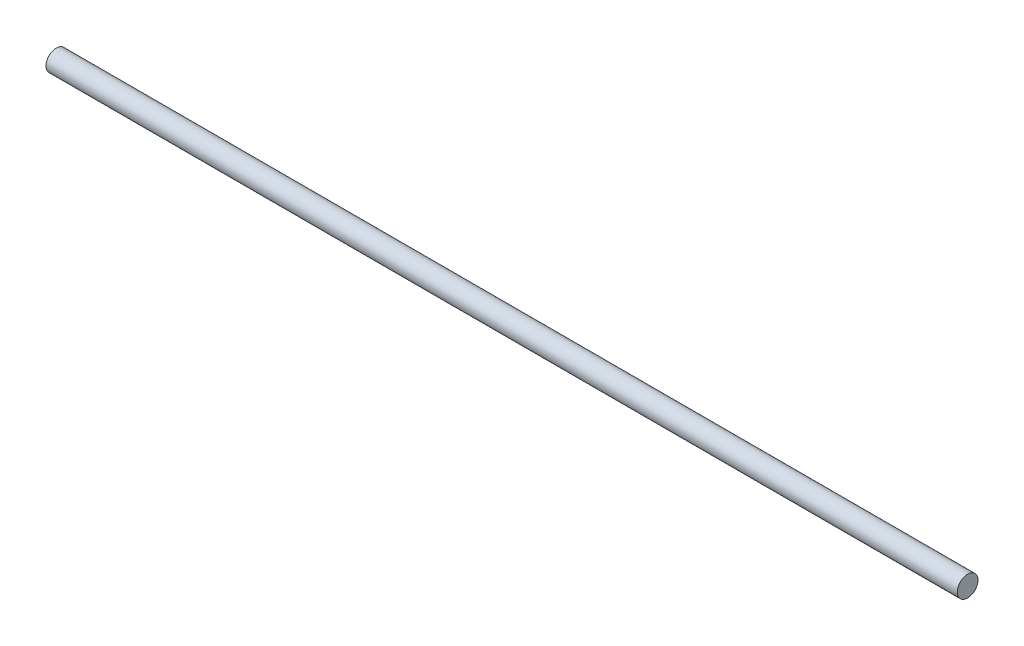
ISO-10303-21;
HEADER;
FILE_DESCRIPTION(('STEP AP214'),'2;1');
FILE_NAME('part.step','',(''),(''),'','','');
FILE_SCHEMA(('AUTOMOTIVE_DESIGN { 1 0 10303 214 1 1 1 1 }'));
ENDSEC;
DATA;
#1=APPLICATION_CONTEXT('core data for automotive mechanical design processes');
#2=APPLICATION_PROTOCOL_DEFINITION('international standard','automotive_design',2000,#1);
#3=PRODUCT_CONTEXT('',#1,'mechanical');
#4=PRODUCT('Part','Part','',(#3));
#5=PRODUCT_RELATED_PRODUCT_CATEGORY('part','',(#4));
#6=PRODUCT_DEFINITION_FORMATION('','',#4);
#7=PRODUCT_DEFINITION_CONTEXT('part definition',#1,'design');
#8=PRODUCT_DEFINITION('design','',#6,#7);
#9=PRODUCT_DEFINITION_SHAPE('','',#8);
#10=(LENGTH_UNIT() NAMED_UNIT(*) SI_UNIT(.MILLI.,.METRE.));
#11=(NAMED_UNIT(*) PLANE_ANGLE_UNIT() SI_UNIT($,.RADIAN.));
#12=(NAMED_UNIT(*) SI_UNIT($,.STERADIAN.) SOLID_ANGLE_UNIT());
#13=UNCERTAINTY_MEASURE_WITH_UNIT(LENGTH_MEASURE(1.E-05),#10,'distance_accuracy_value','');
#14=(GEOMETRIC_REPRESENTATION_CONTEXT(3) GLOBAL_UNCERTAINTY_ASSIGNED_CONTEXT((#13)) GLOBAL_UNIT_ASSIGNED_CONTEXT((#10,
#11,#12)) REPRESENTATION_CONTEXT('',''));
#15=CARTESIAN_POINT('',(0.,0.,0.));
#16=DIRECTION('',(0.,0.,1.));
#17=DIRECTION('',(1.,0.,0.));
#18=AXIS2_PLACEMENT_3D('',#15,#16,#17);
#19=CARTESIAN_POINT('',(440.,0.24825805628706,0.358321314138099));
#20=DIRECTION('',(-1.,0.,0.));
#21=DIRECTION('',(0.,0.,1.));
#22=AXIS2_PLACEMENT_3D('',#19,#20,#21);
#23=CYLINDRICAL_SURFACE('',#22,5.);
#24=CARTESIAN_POINT('',(440.,0.24825805628706,0.358321314138099));
#25=DIRECTION('',(1.,0.,0.));
#26=DIRECTION('',(0.,0.,-1.));
#27=AXIS2_PLACEMENT_3D('',#24,#25,#26);
#28=CIRCLE('',#27,5.);
#29=CARTESIAN_POINT('',(440.,0.24825805628706,-4.6416786858619));
#30=VERTEX_POINT('',#29);
#31=EDGE_CURVE('E10',#30,#30,#28,.T.);
#32=ORIENTED_EDGE('',*,*,#31,.F.);
#33=EDGE_LOOP('',(#32));
#34=FACE_BOUND('',#33,.T.);
#35=CARTESIAN_POINT('',(0.,0.24825805628706,0.358321314138099));
#36=DIRECTION('',(1.,0.,0.));
#37=DIRECTION('',(0.,0.,-1.));
#38=AXIS2_PLACEMENT_3D('',#35,#36,#37);
#39=CIRCLE('',#38,5.);
#40=CARTESIAN_POINT('',(0.,0.24825805628706,-4.6416786858619));
#41=VERTEX_POINT('',#40);
#42=EDGE_CURVE('E34',#41,#41,#39,.T.);
#43=ORIENTED_EDGE('',*,*,#42,.T.);
#44=EDGE_LOOP('',(#43));
#45=FACE_BOUND('',#44,.T.);
#46=ADVANCED_FACE('F31',(#34,#45),#23,.T.);
#47=CARTESIAN_POINT('',(440.,0.24825805628706,0.358321314138099));
#48=DIRECTION('',(1.,0.,0.));
#49=DIRECTION('',(0.,0.,-1.));
#50=AXIS2_PLACEMENT_3D('',#47,#48,#49);
#51=PLANE('',#50);
#52=ORIENTED_EDGE('',*,*,#31,.T.);
#53=EDGE_LOOP('',(#52));
#54=FACE_BOUND('',#53,.T.);
#55=ADVANCED_FACE('F46',(#54),#51,.T.);
#56=CARTESIAN_POINT('',(0.,0.24825805628706,0.358321314138099));
#57=DIRECTION('',(1.,0.,0.));
#58=DIRECTION('',(0.,0.,-1.));
#59=AXIS2_PLACEMENT_3D('',#56,#57,#58);
#60=PLANE('',#59);
#61=ORIENTED_EDGE('',*,*,#42,.F.);
#62=EDGE_LOOP('',(#61));
#63=FACE_BOUND('',#62,.T.);
#64=ADVANCED_FACE('F44',(#63),#60,.F.);
#65=CLOSED_SHELL('',(#46,#55,#64));
#66=MANIFOLD_SOLID_BREP('B2',#65);
#67=ADVANCED_BREP_SHAPE_REPRESENTATION('',(#18,#66),#14);
#68=SHAPE_DEFINITION_REPRESENTATION(#9,#67);
ENDSEC;
END-ISO-10303-21;
